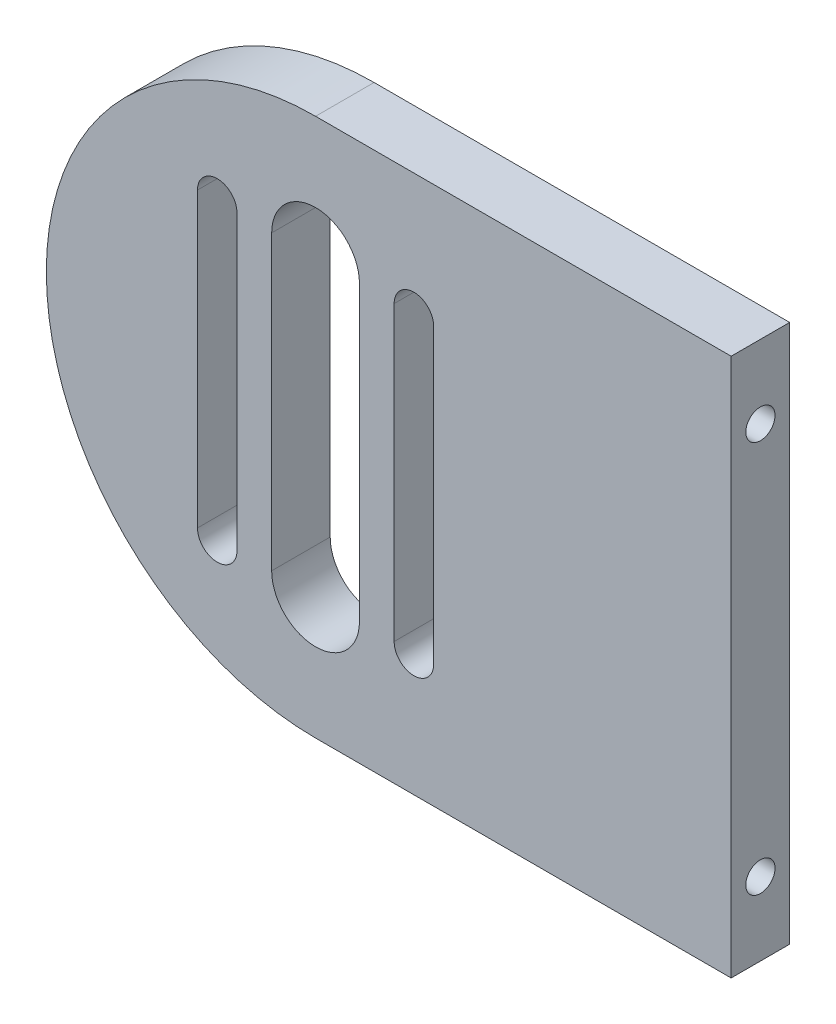
ISO-10303-21;
HEADER;
FILE_DESCRIPTION(('STEP AP214'),'2;1');
FILE_NAME('part.step','',(''),(''),'','','');
FILE_SCHEMA(('AUTOMOTIVE_DESIGN { 1 0 10303 214 1 1 1 1 }'));
ENDSEC;
DATA;
#1=APPLICATION_CONTEXT('core data for automotive mechanical design processes');
#2=APPLICATION_PROTOCOL_DEFINITION('international standard','automotive_design',2000,#1);
#3=PRODUCT_CONTEXT('',#1,'mechanical');
#4=PRODUCT('Part','Part','',(#3));
#5=PRODUCT_RELATED_PRODUCT_CATEGORY('part','',(#4));
#6=PRODUCT_DEFINITION_FORMATION('','',#4);
#7=PRODUCT_DEFINITION_CONTEXT('part definition',#1,'design');
#8=PRODUCT_DEFINITION('design','',#6,#7);
#9=PRODUCT_DEFINITION_SHAPE('','',#8);
#10=(LENGTH_UNIT() NAMED_UNIT(*) SI_UNIT(.MILLI.,.METRE.));
#11=(NAMED_UNIT(*) PLANE_ANGLE_UNIT() SI_UNIT($,.RADIAN.));
#12=(NAMED_UNIT(*) SI_UNIT($,.STERADIAN.) SOLID_ANGLE_UNIT());
#13=UNCERTAINTY_MEASURE_WITH_UNIT(LENGTH_MEASURE(1.E-05),#10,'distance_accuracy_value','');
#14=(GEOMETRIC_REPRESENTATION_CONTEXT(3) GLOBAL_UNCERTAINTY_ASSIGNED_CONTEXT((#13)) GLOBAL_UNIT_ASSIGNED_CONTEXT((#10,
#11,#12)) REPRESENTATION_CONTEXT('',''));
#15=CARTESIAN_POINT('',(0.,0.,0.));
#16=DIRECTION('',(0.,0.,1.));
#17=DIRECTION('',(1.,0.,0.));
#18=AXIS2_PLACEMENT_3D('',#15,#16,#17);
#19=CARTESIAN_POINT('',(0.,0.,4.));
#20=DIRECTION('',(0.,0.,1.));
#21=DIRECTION('',(1.,0.,0.));
#22=AXIS2_PLACEMENT_3D('',#19,#20,#21);
#23=PLANE('',#22);
#24=CARTESIAN_POINT('',(0.,0.,4.));
#25=DIRECTION('',(0.,0.,1.));
#26=DIRECTION('',(1.,0.,0.));
#27=AXIS2_PLACEMENT_3D('',#24,#25,#26);
#28=CIRCLE('',#27,18.4);
#29=CARTESIAN_POINT('',(0.,18.4,4.));
#30=VERTEX_POINT('',#29);
#31=CARTESIAN_POINT('',(0.,-18.4,4.));
#32=VERTEX_POINT('',#31);
#33=EDGE_CURVE('E242',#30,#32,#28,.T.);
#34=ORIENTED_EDGE('',*,*,#33,.T.);
#35=DIRECTION('',(1.,0.,0.));
#36=VECTOR('',#35,1.);
#37=CARTESIAN_POINT('',(28.4,-18.4,4.));
#38=LINE('',#37,#36);
#39=CARTESIAN_POINT('',(28.4,-18.4,4.));
#40=VERTEX_POINT('',#39);
#41=EDGE_CURVE('E245',#32,#40,#38,.T.);
#42=ORIENTED_EDGE('',*,*,#41,.T.);
#43=DIRECTION('',(0.,1.,0.));
#44=VECTOR('',#43,1.);
#45=CARTESIAN_POINT('',(28.4,0.,4.));
#46=LINE('',#45,#44);
#47=CARTESIAN_POINT('',(28.4,18.4,4.));
#48=VERTEX_POINT('',#47);
#49=EDGE_CURVE('E248',#40,#48,#46,.T.);
#50=ORIENTED_EDGE('',*,*,#49,.T.);
#51=DIRECTION('',(-1.,0.,0.));
#52=VECTOR('',#51,1.);
#53=CARTESIAN_POINT('',(28.4,18.4,4.));
#54=LINE('',#53,#52);
#55=EDGE_CURVE('E250',#48,#30,#54,.T.);
#56=ORIENTED_EDGE('',*,*,#55,.T.);
#57=EDGE_LOOP('',(#34,#42,#50,#56));
#58=FACE_BOUND('',#57,.T.);
#59=DIRECTION('',(0.,-1.,0.));
#60=VECTOR('',#59,1.);
#61=CARTESIAN_POINT('',(5.37,0.,4.));
#62=LINE('',#61,#60);
#63=CARTESIAN_POINT('',(5.37,10.,4.));
#64=VERTEX_POINT('',#63);
#65=CARTESIAN_POINT('',(5.37,-10.,4.));
#66=VERTEX_POINT('',#65);
#67=EDGE_CURVE('E213',#64,#66,#62,.T.);
#68=ORIENTED_EDGE('',*,*,#67,.F.);
#69=CARTESIAN_POINT('',(6.72,10.,4.));
#70=DIRECTION('',(0.,0.,1.));
#71=DIRECTION('',(-1.,0.,0.));
#72=AXIS2_PLACEMENT_3D('',#69,#70,#71);
#73=CIRCLE('',#72,1.35);
#74=CARTESIAN_POINT('',(8.07,10.,4.));
#75=VERTEX_POINT('',#74);
#76=EDGE_CURVE('E211',#75,#64,#73,.T.);
#77=ORIENTED_EDGE('',*,*,#76,.F.);
#78=DIRECTION('',(0.,1.,0.));
#79=VECTOR('',#78,1.);
#80=CARTESIAN_POINT('',(8.07,10.,4.));
#81=LINE('',#80,#79);
#82=CARTESIAN_POINT('',(8.07,-10.,4.));
#83=VERTEX_POINT('',#82);
#84=EDGE_CURVE('E219',#83,#75,#81,.T.);
#85=ORIENTED_EDGE('',*,*,#84,.F.);
#86=CARTESIAN_POINT('',(6.72,-10.,4.));
#87=DIRECTION('',(0.,0.,1.));
#88=DIRECTION('',(1.,0.,0.));
#89=AXIS2_PLACEMENT_3D('',#86,#87,#88);
#90=CIRCLE('',#89,1.35);
#91=EDGE_CURVE('E216',#66,#83,#90,.T.);
#92=ORIENTED_EDGE('',*,*,#91,.F.);
#93=EDGE_LOOP('',(#68,#77,#85,#92));
#94=FACE_BOUND('',#93,.T.);
#95=CARTESIAN_POINT('',(0.,10.,4.));
#96=DIRECTION('',(0.,0.,1.));
#97=DIRECTION('',(-1.,0.,0.));
#98=AXIS2_PLACEMENT_3D('',#95,#96,#97);
#99=CIRCLE('',#98,3.);
#100=CARTESIAN_POINT('',(3.,10.,4.));
#101=VERTEX_POINT('',#100);
#102=CARTESIAN_POINT('',(-3.,10.,4.));
#103=VERTEX_POINT('',#102);
#104=EDGE_CURVE('E183',#101,#103,#99,.T.);
#105=ORIENTED_EDGE('',*,*,#104,.F.);
#106=DIRECTION('',(0.,1.,0.));
#107=VECTOR('',#106,1.);
#108=CARTESIAN_POINT('',(3.,0.,4.));
#109=LINE('',#108,#107);
#110=CARTESIAN_POINT('',(3.,-10.,4.));
#111=VERTEX_POINT('',#110);
#112=EDGE_CURVE('E181',#111,#101,#109,.T.);
#113=ORIENTED_EDGE('',*,*,#112,.F.);
#114=CARTESIAN_POINT('',(0.,-10.,4.));
#115=DIRECTION('',(0.,0.,1.));
#116=DIRECTION('',(1.,0.,0.));
#117=AXIS2_PLACEMENT_3D('',#114,#115,#116);
#118=CIRCLE('',#117,3.);
#119=CARTESIAN_POINT('',(-3.,-10.,4.));
#120=VERTEX_POINT('',#119);
#121=EDGE_CURVE('E189',#120,#111,#118,.T.);
#122=ORIENTED_EDGE('',*,*,#121,.F.);
#123=DIRECTION('',(0.,-1.,0.));
#124=VECTOR('',#123,1.);
#125=CARTESIAN_POINT('',(-3.,0.,4.));
#126=LINE('',#125,#124);
#127=EDGE_CURVE('E186',#103,#120,#126,.T.);
#128=ORIENTED_EDGE('',*,*,#127,.F.);
#129=EDGE_LOOP('',(#105,#113,#122,#128));
#130=FACE_BOUND('',#129,.T.);
#131=DIRECTION('',(0.,-1.,0.));
#132=VECTOR('',#131,1.);
#133=CARTESIAN_POINT('',(-8.07,10.,4.));
#134=LINE('',#133,#132);
#135=CARTESIAN_POINT('',(-8.07,10.,4.));
#136=VERTEX_POINT('',#135);
#137=CARTESIAN_POINT('',(-8.07,-10.,4.));
#138=VERTEX_POINT('',#137);
#139=EDGE_CURVE('E161',#136,#138,#134,.T.);
#140=ORIENTED_EDGE('',*,*,#139,.F.);
#141=CARTESIAN_POINT('',(-6.72,10.,4.));
#142=DIRECTION('',(0.,0.,1.));
#143=DIRECTION('',(1.,0.,0.));
#144=AXIS2_PLACEMENT_3D('',#141,#142,#143);
#145=CIRCLE('',#144,1.35);
#146=CARTESIAN_POINT('',(-5.37,10.,4.));
#147=VERTEX_POINT('',#146);
#148=EDGE_CURVE('E148',#147,#136,#145,.T.);
#149=ORIENTED_EDGE('',*,*,#148,.F.);
#150=DIRECTION('',(0.,1.,0.));
#151=VECTOR('',#150,1.);
#152=CARTESIAN_POINT('',(-5.37,0.,4.));
#153=LINE('',#152,#151);
#154=CARTESIAN_POINT('',(-5.37,-10.,4.));
#155=VERTEX_POINT('',#154);
#156=EDGE_CURVE('E143',#155,#147,#153,.T.);
#157=ORIENTED_EDGE('',*,*,#156,.F.);
#158=CARTESIAN_POINT('',(-6.72,-10.,4.));
#159=DIRECTION('',(0.,0.,1.));
#160=DIRECTION('',(-1.,0.,0.));
#161=AXIS2_PLACEMENT_3D('',#158,#159,#160);
#162=CIRCLE('',#161,1.35);
#163=EDGE_CURVE('E163',#138,#155,#162,.T.);
#164=ORIENTED_EDGE('',*,*,#163,.F.);
#165=EDGE_LOOP('',(#140,#149,#157,#164));
#166=FACE_BOUND('',#165,.T.);
#167=ADVANCED_FACE('F33',(#58,#94,#130,#166),#23,.T.);
#168=CARTESIAN_POINT('',(0.,0.,0.));
#169=DIRECTION('',(0.,0.,1.));
#170=DIRECTION('',(1.,0.,0.));
#171=AXIS2_PLACEMENT_3D('',#168,#169,#170);
#172=PLANE('',#171);
#173=DIRECTION('',(0.,1.,0.));
#174=VECTOR('',#173,1.);
#175=CARTESIAN_POINT('',(3.,0.,0.));
#176=LINE('',#175,#174);
#177=CARTESIAN_POINT('',(3.,-10.,0.));
#178=VERTEX_POINT('',#177);
#179=CARTESIAN_POINT('',(3.,10.,0.));
#180=VERTEX_POINT('',#179);
#181=EDGE_CURVE('E157',#178,#180,#176,.T.);
#182=ORIENTED_EDGE('',*,*,#181,.T.);
#183=CARTESIAN_POINT('',(0.,10.,0.));
#184=DIRECTION('',(0.,0.,1.));
#185=DIRECTION('',(-1.,0.,0.));
#186=AXIS2_PLACEMENT_3D('',#183,#184,#185);
#187=CIRCLE('',#186,3.);
#188=CARTESIAN_POINT('',(-3.,10.,0.));
#189=VERTEX_POINT('',#188);
#190=EDGE_CURVE('E194',#180,#189,#187,.T.);
#191=ORIENTED_EDGE('',*,*,#190,.T.);
#192=DIRECTION('',(0.,-1.,0.));
#193=VECTOR('',#192,1.);
#194=CARTESIAN_POINT('',(-3.,0.,0.));
#195=LINE('',#194,#193);
#196=CARTESIAN_POINT('',(-3.,-10.,0.));
#197=VERTEX_POINT('',#196);
#198=EDGE_CURVE('E197',#189,#197,#195,.T.);
#199=ORIENTED_EDGE('',*,*,#198,.T.);
#200=CARTESIAN_POINT('',(0.,-10.,0.));
#201=DIRECTION('',(0.,0.,1.));
#202=DIRECTION('',(1.,0.,0.));
#203=AXIS2_PLACEMENT_3D('',#200,#201,#202);
#204=CIRCLE('',#203,3.);
#205=EDGE_CURVE('E184',#197,#178,#204,.T.);
#206=ORIENTED_EDGE('',*,*,#205,.T.);
#207=EDGE_LOOP('',(#182,#191,#199,#206));
#208=FACE_BOUND('',#207,.T.);
#209=CARTESIAN_POINT('',(0.,0.,0.));
#210=DIRECTION('',(0.,0.,1.));
#211=DIRECTION('',(1.,0.,0.));
#212=AXIS2_PLACEMENT_3D('',#209,#210,#211);
#213=CIRCLE('',#212,18.4);
#214=CARTESIAN_POINT('',(0.,18.4,0.));
#215=VERTEX_POINT('',#214);
#216=CARTESIAN_POINT('',(0.,-18.4,0.));
#217=VERTEX_POINT('',#216);
#218=EDGE_CURVE('E241',#215,#217,#213,.T.);
#219=ORIENTED_EDGE('',*,*,#218,.F.);
#220=DIRECTION('',(-1.,0.,0.));
#221=VECTOR('',#220,1.);
#222=CARTESIAN_POINT('',(28.4,18.4,0.));
#223=LINE('',#222,#221);
#224=CARTESIAN_POINT('',(28.4,18.4,0.));
#225=VERTEX_POINT('',#224);
#226=EDGE_CURVE('E246',#225,#215,#223,.T.);
#227=ORIENTED_EDGE('',*,*,#226,.F.);
#228=DIRECTION('',(0.,1.,0.));
#229=VECTOR('',#228,1.);
#230=CARTESIAN_POINT('',(28.4,0.,0.));
#231=LINE('',#230,#229);
#232=CARTESIAN_POINT('',(28.4,-18.4,0.));
#233=VERTEX_POINT('',#232);
#234=EDGE_CURVE('E258',#233,#225,#231,.T.);
#235=ORIENTED_EDGE('',*,*,#234,.F.);
#236=DIRECTION('',(1.,0.,0.));
#237=VECTOR('',#236,1.);
#238=CARTESIAN_POINT('',(28.4,-18.4,0.));
#239=LINE('',#238,#237);
#240=EDGE_CURVE('E255',#217,#233,#239,.T.);
#241=ORIENTED_EDGE('',*,*,#240,.F.);
#242=EDGE_LOOP('',(#219,#227,#235,#241));
#243=FACE_BOUND('',#242,.T.);
#244=CARTESIAN_POINT('',(6.72,10.,0.));
#245=DIRECTION('',(0.,0.,1.));
#246=DIRECTION('',(-1.,0.,0.));
#247=AXIS2_PLACEMENT_3D('',#244,#245,#246);
#248=CIRCLE('',#247,1.35);
#249=CARTESIAN_POINT('',(8.07,10.,0.));
#250=VERTEX_POINT('',#249);
#251=CARTESIAN_POINT('',(5.37,10.,0.));
#252=VERTEX_POINT('',#251);
#253=EDGE_CURVE('E210',#250,#252,#248,.T.);
#254=ORIENTED_EDGE('',*,*,#253,.T.);
#255=DIRECTION('',(0.,-1.,0.));
#256=VECTOR('',#255,1.);
#257=CARTESIAN_POINT('',(5.37,0.,0.));
#258=LINE('',#257,#256);
#259=CARTESIAN_POINT('',(5.37,-10.,0.));
#260=VERTEX_POINT('',#259);
#261=EDGE_CURVE('E224',#252,#260,#258,.T.);
#262=ORIENTED_EDGE('',*,*,#261,.T.);
#263=CARTESIAN_POINT('',(6.72,-10.,0.));
#264=DIRECTION('',(0.,0.,1.));
#265=DIRECTION('',(1.,0.,0.));
#266=AXIS2_PLACEMENT_3D('',#263,#264,#265);
#267=CIRCLE('',#266,1.35);
#268=CARTESIAN_POINT('',(8.07,-10.,0.));
#269=VERTEX_POINT('',#268);
#270=EDGE_CURVE('E227',#260,#269,#267,.T.);
#271=ORIENTED_EDGE('',*,*,#270,.T.);
#272=DIRECTION('',(0.,1.,0.));
#273=VECTOR('',#272,1.);
#274=CARTESIAN_POINT('',(8.07,10.,0.));
#275=LINE('',#274,#273);
#276=EDGE_CURVE('E214',#269,#250,#275,.T.);
#277=ORIENTED_EDGE('',*,*,#276,.T.);
#278=EDGE_LOOP('',(#254,#262,#271,#277));
#279=FACE_BOUND('',#278,.T.);
#280=CARTESIAN_POINT('',(-6.72,10.,0.));
#281=DIRECTION('',(0.,0.,1.));
#282=DIRECTION('',(1.,0.,0.));
#283=AXIS2_PLACEMENT_3D('',#280,#281,#282);
#284=CIRCLE('',#283,1.35);
#285=CARTESIAN_POINT('',(-5.37,10.,0.));
#286=VERTEX_POINT('',#285);
#287=CARTESIAN_POINT('',(-8.07,10.,0.));
#288=VERTEX_POINT('',#287);
#289=EDGE_CURVE('E155',#286,#288,#284,.T.);
#290=ORIENTED_EDGE('',*,*,#289,.T.);
#291=DIRECTION('',(0.,-1.,0.));
#292=VECTOR('',#291,1.);
#293=CARTESIAN_POINT('',(-8.07,10.,0.));
#294=LINE('',#293,#292);
#295=CARTESIAN_POINT('',(-8.07,-10.,0.));
#296=VERTEX_POINT('',#295);
#297=EDGE_CURVE('E169',#288,#296,#294,.T.);
#298=ORIENTED_EDGE('',*,*,#297,.T.);
#299=CARTESIAN_POINT('',(-6.72,-10.,0.));
#300=DIRECTION('',(0.,0.,1.));
#301=DIRECTION('',(-1.,0.,0.));
#302=AXIS2_PLACEMENT_3D('',#299,#300,#301);
#303=CIRCLE('',#302,1.35);
#304=CARTESIAN_POINT('',(-5.37,-10.,0.));
#305=VERTEX_POINT('',#304);
#306=EDGE_CURVE('E173',#296,#305,#303,.T.);
#307=ORIENTED_EDGE('',*,*,#306,.T.);
#308=DIRECTION('',(0.,1.,0.));
#309=VECTOR('',#308,1.);
#310=CARTESIAN_POINT('',(-5.37,0.,0.));
#311=LINE('',#310,#309);
#312=EDGE_CURVE('E149',#305,#286,#311,.T.);
#313=ORIENTED_EDGE('',*,*,#312,.T.);
#314=EDGE_LOOP('',(#290,#298,#307,#313));
#315=FACE_BOUND('',#314,.T.);
#316=ADVANCED_FACE('F276',(#208,#243,#279,#315),#172,.F.);
#317=CARTESIAN_POINT('',(0.,0.,4.));
#318=DIRECTION('',(0.,0.,-1.));
#319=DIRECTION('',(-1.,0.,0.));
#320=AXIS2_PLACEMENT_3D('',#317,#318,#319);
#321=CYLINDRICAL_SURFACE('',#320,18.4);
#322=ORIENTED_EDGE('',*,*,#218,.T.);
#323=DIRECTION('',(0.,0.,-1.));
#324=VECTOR('',#323,1.);
#325=CARTESIAN_POINT('',(0.,-18.4,4.));
#326=LINE('',#325,#324);
#327=EDGE_CURVE('E11',#32,#217,#326,.T.);
#328=ORIENTED_EDGE('',*,*,#327,.F.);
#329=ORIENTED_EDGE('',*,*,#33,.F.);
#330=DIRECTION('',(0.,0.,-1.));
#331=VECTOR('',#330,1.);
#332=CARTESIAN_POINT('',(0.,18.4,4.));
#333=LINE('',#332,#331);
#334=EDGE_CURVE('E252',#30,#215,#333,.T.);
#335=ORIENTED_EDGE('',*,*,#334,.T.);
#336=EDGE_LOOP('',(#322,#328,#329,#335));
#337=FACE_BOUND('',#336,.T.);
#338=ADVANCED_FACE('F35',(#337),#321,.T.);
#339=CARTESIAN_POINT('',(28.4,-18.4,4.));
#340=DIRECTION('',(0.,1.,0.));
#341=DIRECTION('',(0.,0.,1.));
#342=AXIS2_PLACEMENT_3D('',#339,#340,#341);
#343=PLANE('',#342);
#344=ORIENTED_EDGE('',*,*,#240,.T.);
#345=DIRECTION('',(0.,0.,-1.));
#346=VECTOR('',#345,1.);
#347=CARTESIAN_POINT('',(28.4,-18.4,4.));
#348=LINE('',#347,#346);
#349=EDGE_CURVE('E41',#40,#233,#348,.T.);
#350=ORIENTED_EDGE('',*,*,#349,.F.);
#351=ORIENTED_EDGE('',*,*,#41,.F.);
#352=ORIENTED_EDGE('',*,*,#327,.T.);
#353=EDGE_LOOP('',(#344,#350,#351,#352));
#354=FACE_BOUND('',#353,.T.);
#355=ADVANCED_FACE('F272',(#354),#343,.F.);
#356=CARTESIAN_POINT('',(28.4,0.,4.));
#357=DIRECTION('',(-1.,0.,0.));
#358=DIRECTION('',(0.,0.,1.));
#359=AXIS2_PLACEMENT_3D('',#356,#357,#358);
#360=PLANE('',#359);
#361=CARTESIAN_POINT('',(28.4,13.4,2.));
#362=DIRECTION('',(1.,0.,0.));
#363=DIRECTION('',(0.,0.,-1.));
#364=AXIS2_PLACEMENT_3D('',#361,#362,#363);
#365=CIRCLE('',#364,1.);
#366=CARTESIAN_POINT('',(28.4,13.4,0.999999999999999));
#367=VERTEX_POINT('',#366);
#368=EDGE_CURVE('E513',#367,#367,#365,.T.);
#369=ORIENTED_EDGE('',*,*,#368,.F.);
#370=EDGE_LOOP('',(#369));
#371=FACE_BOUND('',#370,.T.);
#372=CARTESIAN_POINT('',(28.4,-13.4,2.));
#373=DIRECTION('',(1.,0.,0.));
#374=DIRECTION('',(0.,0.,1.));
#375=AXIS2_PLACEMENT_3D('',#372,#373,#374);
#376=CIRCLE('',#375,1.);
#377=CARTESIAN_POINT('',(28.4,-13.4,3.));
#378=VERTEX_POINT('',#377);
#379=EDGE_CURVE('E520',#378,#378,#376,.T.);
#380=ORIENTED_EDGE('',*,*,#379,.F.);
#381=EDGE_LOOP('',(#380));
#382=FACE_BOUND('',#381,.T.);
#383=ORIENTED_EDGE('',*,*,#234,.T.);
#384=DIRECTION('',(0.,0.,-1.));
#385=VECTOR('',#384,1.);
#386=CARTESIAN_POINT('',(28.4,18.4,4.));
#387=LINE('',#386,#385);
#388=EDGE_CURVE('E263',#48,#225,#387,.T.);
#389=ORIENTED_EDGE('',*,*,#388,.F.);
#390=ORIENTED_EDGE('',*,*,#49,.F.);
#391=ORIENTED_EDGE('',*,*,#349,.T.);
#392=EDGE_LOOP('',(#383,#389,#390,#391));
#393=FACE_BOUND('',#392,.T.);
#394=ADVANCED_FACE('F269',(#371,#382,#393),#360,.F.);
#395=CARTESIAN_POINT('',(28.4,18.4,4.));
#396=DIRECTION('',(0.,-1.,0.));
#397=DIRECTION('',(0.,0.,-1.));
#398=AXIS2_PLACEMENT_3D('',#395,#396,#397);
#399=PLANE('',#398);
#400=ORIENTED_EDGE('',*,*,#226,.T.);
#401=ORIENTED_EDGE('',*,*,#334,.F.);
#402=ORIENTED_EDGE('',*,*,#55,.F.);
#403=ORIENTED_EDGE('',*,*,#388,.T.);
#404=EDGE_LOOP('',(#400,#401,#402,#403));
#405=FACE_BOUND('',#404,.T.);
#406=ADVANCED_FACE('F281',(#405),#399,.F.);
#407=CARTESIAN_POINT('',(6.72,10.,4.));
#408=DIRECTION('',(0.,0.,-1.));
#409=DIRECTION('',(-1.,0.,0.));
#410=AXIS2_PLACEMENT_3D('',#407,#408,#409);
#411=CYLINDRICAL_SURFACE('',#410,1.35);
#412=ORIENTED_EDGE('',*,*,#253,.F.);
#413=DIRECTION('',(0.,0.,-1.));
#414=VECTOR('',#413,1.);
#415=CARTESIAN_POINT('',(8.07,10.,4.));
#416=LINE('',#415,#414);
#417=EDGE_CURVE('E221',#75,#250,#416,.T.);
#418=ORIENTED_EDGE('',*,*,#417,.F.);
#419=ORIENTED_EDGE('',*,*,#76,.T.);
#420=DIRECTION('',(0.,0.,-1.));
#421=VECTOR('',#420,1.);
#422=CARTESIAN_POINT('',(5.37,10.,4.));
#423=LINE('',#422,#421);
#424=EDGE_CURVE('E238',#64,#252,#423,.T.);
#425=ORIENTED_EDGE('',*,*,#424,.T.);
#426=EDGE_LOOP('',(#412,#418,#419,#425));
#427=FACE_BOUND('',#426,.T.);
#428=ADVANCED_FACE('F338',(#427),#411,.F.);
#429=CARTESIAN_POINT('',(5.37,0.,4.));
#430=DIRECTION('',(1.,0.,0.));
#431=DIRECTION('',(0.,0.,-1.));
#432=AXIS2_PLACEMENT_3D('',#429,#430,#431);
#433=PLANE('',#432);
#434=ORIENTED_EDGE('',*,*,#261,.F.);
#435=ORIENTED_EDGE('',*,*,#424,.F.);
#436=ORIENTED_EDGE('',*,*,#67,.T.);
#437=DIRECTION('',(0.,0.,-1.));
#438=VECTOR('',#437,1.);
#439=CARTESIAN_POINT('',(5.37,-10.,4.));
#440=LINE('',#439,#438);
#441=EDGE_CURVE('E236',#66,#260,#440,.T.);
#442=ORIENTED_EDGE('',*,*,#441,.T.);
#443=EDGE_LOOP('',(#434,#435,#436,#442));
#444=FACE_BOUND('',#443,.T.);
#445=ADVANCED_FACE('F334',(#444),#433,.T.);
#446=CARTESIAN_POINT('',(6.72,-10.,4.));
#447=DIRECTION('',(0.,0.,-1.));
#448=DIRECTION('',(-1.,0.,0.));
#449=AXIS2_PLACEMENT_3D('',#446,#447,#448);
#450=CYLINDRICAL_SURFACE('',#449,1.35);
#451=ORIENTED_EDGE('',*,*,#270,.F.);
#452=ORIENTED_EDGE('',*,*,#441,.F.);
#453=ORIENTED_EDGE('',*,*,#91,.T.);
#454=DIRECTION('',(0.,0.,-1.));
#455=VECTOR('',#454,1.);
#456=CARTESIAN_POINT('',(8.07,-10.,4.));
#457=LINE('',#456,#455);
#458=EDGE_CURVE('E234',#83,#269,#457,.T.);
#459=ORIENTED_EDGE('',*,*,#458,.T.);
#460=EDGE_LOOP('',(#451,#452,#453,#459));
#461=FACE_BOUND('',#460,.T.);
#462=ADVANCED_FACE('F330',(#461),#450,.F.);
#463=CARTESIAN_POINT('',(8.07,10.,4.));
#464=DIRECTION('',(-1.,0.,0.));
#465=DIRECTION('',(0.,-1.,0.));
#466=AXIS2_PLACEMENT_3D('',#463,#464,#465);
#467=PLANE('',#466);
#468=ORIENTED_EDGE('',*,*,#276,.F.);
#469=ORIENTED_EDGE('',*,*,#458,.F.);
#470=ORIENTED_EDGE('',*,*,#84,.T.);
#471=ORIENTED_EDGE('',*,*,#417,.T.);
#472=EDGE_LOOP('',(#468,#469,#470,#471));
#473=FACE_BOUND('',#472,.T.);
#474=ADVANCED_FACE('F327',(#473),#467,.T.);
#475=CARTESIAN_POINT('',(3.,0.,4.));
#476=DIRECTION('',(-1.,0.,0.));
#477=DIRECTION('',(0.,0.,1.));
#478=AXIS2_PLACEMENT_3D('',#475,#476,#477);
#479=PLANE('',#478);
#480=ORIENTED_EDGE('',*,*,#181,.F.);
#481=DIRECTION('',(0.,0.,-1.));
#482=VECTOR('',#481,1.);
#483=CARTESIAN_POINT('',(3.,-10.,4.));
#484=LINE('',#483,#482);
#485=EDGE_CURVE('E191',#111,#178,#484,.T.);
#486=ORIENTED_EDGE('',*,*,#485,.F.);
#487=ORIENTED_EDGE('',*,*,#112,.T.);
#488=DIRECTION('',(0.,0.,-1.));
#489=VECTOR('',#488,1.);
#490=CARTESIAN_POINT('',(3.,10.,4.));
#491=LINE('',#490,#489);
#492=EDGE_CURVE('E208',#101,#180,#491,.T.);
#493=ORIENTED_EDGE('',*,*,#492,.T.);
#494=EDGE_LOOP('',(#480,#486,#487,#493));
#495=FACE_BOUND('',#494,.T.);
#496=ADVANCED_FACE('F309',(#495),#479,.T.);
#497=CARTESIAN_POINT('',(0.,10.,4.));
#498=DIRECTION('',(0.,0.,-1.));
#499=DIRECTION('',(-1.,0.,0.));
#500=AXIS2_PLACEMENT_3D('',#497,#498,#499);
#501=CYLINDRICAL_SURFACE('',#500,3.);
#502=ORIENTED_EDGE('',*,*,#190,.F.);
#503=ORIENTED_EDGE('',*,*,#492,.F.);
#504=ORIENTED_EDGE('',*,*,#104,.T.);
#505=DIRECTION('',(0.,0.,-1.));
#506=VECTOR('',#505,1.);
#507=CARTESIAN_POINT('',(-3.,10.,4.));
#508=LINE('',#507,#506);
#509=EDGE_CURVE('E205',#103,#189,#508,.T.);
#510=ORIENTED_EDGE('',*,*,#509,.T.);
#511=EDGE_LOOP('',(#502,#503,#504,#510));
#512=FACE_BOUND('',#511,.T.);
#513=ADVANCED_FACE('F301',(#512),#501,.F.);
#514=CARTESIAN_POINT('',(-3.,0.,4.));
#515=DIRECTION('',(1.,0.,0.));
#516=DIRECTION('',(0.,1.,0.));
#517=AXIS2_PLACEMENT_3D('',#514,#515,#516);
#518=PLANE('',#517);
#519=ORIENTED_EDGE('',*,*,#198,.F.);
#520=ORIENTED_EDGE('',*,*,#509,.F.);
#521=ORIENTED_EDGE('',*,*,#127,.T.);
#522=DIRECTION('',(0.,0.,-1.));
#523=VECTOR('',#522,1.);
#524=CARTESIAN_POINT('',(-3.,-10.,4.));
#525=LINE('',#524,#523);
#526=EDGE_CURVE('E203',#120,#197,#525,.T.);
#527=ORIENTED_EDGE('',*,*,#526,.T.);
#528=EDGE_LOOP('',(#519,#520,#521,#527));
#529=FACE_BOUND('',#528,.T.);
#530=ADVANCED_FACE('F303',(#529),#518,.T.);
#531=CARTESIAN_POINT('',(0.,-10.,4.));
#532=DIRECTION('',(0.,0.,-1.));
#533=DIRECTION('',(-1.,0.,0.));
#534=AXIS2_PLACEMENT_3D('',#531,#532,#533);
#535=CYLINDRICAL_SURFACE('',#534,3.);
#536=ORIENTED_EDGE('',*,*,#205,.F.);
#537=ORIENTED_EDGE('',*,*,#526,.F.);
#538=ORIENTED_EDGE('',*,*,#121,.T.);
#539=ORIENTED_EDGE('',*,*,#485,.T.);
#540=EDGE_LOOP('',(#536,#537,#538,#539));
#541=FACE_BOUND('',#540,.T.);
#542=ADVANCED_FACE('F311',(#541),#535,.F.);
#543=CARTESIAN_POINT('',(-6.72,10.,4.));
#544=DIRECTION('',(0.,0.,-1.));
#545=DIRECTION('',(-1.,0.,0.));
#546=AXIS2_PLACEMENT_3D('',#543,#544,#545);
#547=CYLINDRICAL_SURFACE('',#546,1.35);
#548=ORIENTED_EDGE('',*,*,#289,.F.);
#549=DIRECTION('',(0.,0.,-1.));
#550=VECTOR('',#549,1.);
#551=CARTESIAN_POINT('',(-5.37,10.,4.));
#552=LINE('',#551,#550);
#553=EDGE_CURVE('E53',#147,#286,#552,.T.);
#554=ORIENTED_EDGE('',*,*,#553,.F.);
#555=ORIENTED_EDGE('',*,*,#148,.T.);
#556=DIRECTION('',(0.,0.,-1.));
#557=VECTOR('',#556,1.);
#558=CARTESIAN_POINT('',(-8.07,10.,4.));
#559=LINE('',#558,#557);
#560=EDGE_CURVE('E158',#136,#288,#559,.T.);
#561=ORIENTED_EDGE('',*,*,#560,.T.);
#562=EDGE_LOOP('',(#548,#554,#555,#561));
#563=FACE_BOUND('',#562,.T.);
#564=ADVANCED_FACE('F152',(#563),#547,.F.);
#565=CARTESIAN_POINT('',(-8.07,10.,4.));
#566=DIRECTION('',(1.,0.,0.));
#567=DIRECTION('',(0.,1.,0.));
#568=AXIS2_PLACEMENT_3D('',#565,#566,#567);
#569=PLANE('',#568);
#570=ORIENTED_EDGE('',*,*,#297,.F.);
#571=ORIENTED_EDGE('',*,*,#560,.F.);
#572=ORIENTED_EDGE('',*,*,#139,.T.);
#573=DIRECTION('',(0.,0.,-1.));
#574=VECTOR('',#573,1.);
#575=CARTESIAN_POINT('',(-8.07,-10.,4.));
#576=LINE('',#575,#574);
#577=EDGE_CURVE('E178',#138,#296,#576,.T.);
#578=ORIENTED_EDGE('',*,*,#577,.T.);
#579=EDGE_LOOP('',(#570,#571,#572,#578));
#580=FACE_BOUND('',#579,.T.);
#581=ADVANCED_FACE('F318',(#580),#569,.T.);
#582=CARTESIAN_POINT('',(-6.72,-10.,4.));
#583=DIRECTION('',(0.,0.,-1.));
#584=DIRECTION('',(-1.,0.,0.));
#585=AXIS2_PLACEMENT_3D('',#582,#583,#584);
#586=CYLINDRICAL_SURFACE('',#585,1.35);
#587=ORIENTED_EDGE('',*,*,#306,.F.);
#588=ORIENTED_EDGE('',*,*,#577,.F.);
#589=ORIENTED_EDGE('',*,*,#163,.T.);
#590=DIRECTION('',(0.,0.,-1.));
#591=VECTOR('',#590,1.);
#592=CARTESIAN_POINT('',(-5.37,-10.,4.));
#593=LINE('',#592,#591);
#594=EDGE_CURVE('E48',#155,#305,#593,.T.);
#595=ORIENTED_EDGE('',*,*,#594,.T.);
#596=EDGE_LOOP('',(#587,#588,#589,#595));
#597=FACE_BOUND('',#596,.T.);
#598=ADVANCED_FACE('F449',(#597),#586,.F.);
#599=CARTESIAN_POINT('',(-5.37,0.,4.));
#600=DIRECTION('',(-1.,0.,0.));
#601=DIRECTION('',(0.,0.,1.));
#602=AXIS2_PLACEMENT_3D('',#599,#600,#601);
#603=PLANE('',#602);
#604=ORIENTED_EDGE('',*,*,#312,.F.);
#605=ORIENTED_EDGE('',*,*,#594,.F.);
#606=ORIENTED_EDGE('',*,*,#156,.T.);
#607=ORIENTED_EDGE('',*,*,#553,.T.);
#608=EDGE_LOOP('',(#604,#605,#606,#607));
#609=FACE_BOUND('',#608,.T.);
#610=ADVANCED_FACE('F144',(#609),#603,.T.);
#611=CARTESIAN_POINT('',(20.4,-13.4,2.));
#612=DIRECTION('',(1.,0.,0.));
#613=DIRECTION('',(0.,0.,-1.));
#614=AXIS2_PLACEMENT_3D('',#611,#612,#613);
#615=CYLINDRICAL_SURFACE('',#614,1.);
#616=CARTESIAN_POINT('',(20.4,-13.4,2.));
#617=DIRECTION('',(1.,0.,0.));
#618=DIRECTION('',(0.,0.,1.));
#619=AXIS2_PLACEMENT_3D('',#616,#617,#618);
#620=CIRCLE('',#619,1.);
#621=CARTESIAN_POINT('',(20.4,-13.4,3.));
#622=VERTEX_POINT('',#621);
#623=EDGE_CURVE('E516',#622,#622,#620,.T.);
#624=ORIENTED_EDGE('',*,*,#623,.F.);
#625=EDGE_LOOP('',(#624));
#626=FACE_BOUND('',#625,.T.);
#627=ORIENTED_EDGE('',*,*,#379,.T.);
#628=EDGE_LOOP('',(#627));
#629=FACE_BOUND('',#628,.T.);
#630=ADVANCED_FACE('F464',(#626,#629),#615,.F.);
#631=CARTESIAN_POINT('',(20.4,-13.4,2.));
#632=DIRECTION('',(-1.,0.,0.));
#633=DIRECTION('',(0.,0.,1.));
#634=AXIS2_PLACEMENT_3D('',#631,#632,#633);
#635=PLANE('',#634);
#636=ORIENTED_EDGE('',*,*,#623,.T.);
#637=EDGE_LOOP('',(#636));
#638=FACE_BOUND('',#637,.T.);
#639=ADVANCED_FACE('F474',(#638),#635,.F.);
#640=CARTESIAN_POINT('',(20.4,13.4,2.));
#641=DIRECTION('',(1.,0.,0.));
#642=DIRECTION('',(0.,0.,-1.));
#643=AXIS2_PLACEMENT_3D('',#640,#641,#642);
#644=CYLINDRICAL_SURFACE('',#643,1.);
#645=CARTESIAN_POINT('',(20.4,13.4,2.));
#646=DIRECTION('',(1.,0.,0.));
#647=DIRECTION('',(0.,0.,-1.));
#648=AXIS2_PLACEMENT_3D('',#645,#646,#647);
#649=CIRCLE('',#648,1.);
#650=CARTESIAN_POINT('',(20.4,13.4,0.999999999999999));
#651=VERTEX_POINT('',#650);
#652=EDGE_CURVE('E170',#651,#651,#649,.T.);
#653=ORIENTED_EDGE('',*,*,#652,.F.);
#654=EDGE_LOOP('',(#653));
#655=FACE_BOUND('',#654,.T.);
#656=ORIENTED_EDGE('',*,*,#368,.T.);
#657=EDGE_LOOP('',(#656));
#658=FACE_BOUND('',#657,.T.);
#659=ADVANCED_FACE('F483',(#655,#658),#644,.F.);
#660=CARTESIAN_POINT('',(20.4,13.4,2.));
#661=DIRECTION('',(1.,0.,0.));
#662=DIRECTION('',(0.,0.,-1.));
#663=AXIS2_PLACEMENT_3D('',#660,#661,#662);
#664=PLANE('',#663);
#665=ORIENTED_EDGE('',*,*,#652,.T.);
#666=EDGE_LOOP('',(#665));
#667=FACE_BOUND('',#666,.T.);
#668=ADVANCED_FACE('F492',(#667),#664,.T.);
#669=CLOSED_SHELL('',(#167,#316,#338,#355,#394,#406,#428,#445,#462,#474,#496,#513,#530,#542,
#564,#581,#598,#610,#630,#639,#659,#668));
#670=MANIFOLD_SOLID_BREP('B2',#669);
#671=ADVANCED_BREP_SHAPE_REPRESENTATION('',(#18,#670),#14);
#672=SHAPE_DEFINITION_REPRESENTATION(#9,#671);
ENDSEC;
END-ISO-10303-21;
